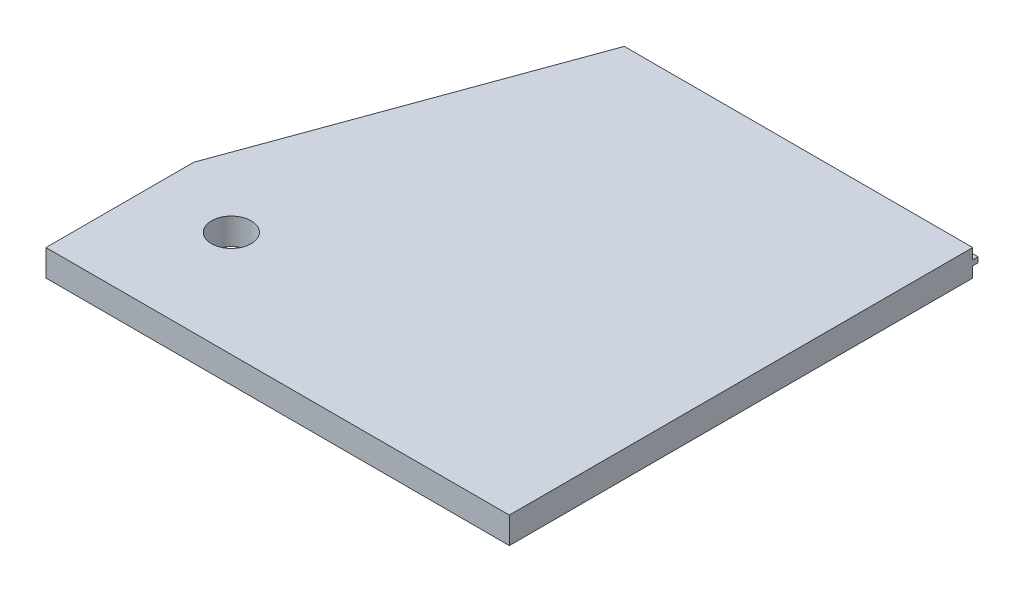
ISO-10303-21;
HEADER;
FILE_DESCRIPTION(('STEP AP214'),'2;1');
FILE_NAME('part.step','',(''),(''),'','','');
FILE_SCHEMA(('AUTOMOTIVE_DESIGN { 1 0 10303 214 1 1 1 1 }'));
ENDSEC;
DATA;
#1=APPLICATION_CONTEXT('core data for automotive mechanical design processes');
#2=APPLICATION_PROTOCOL_DEFINITION('international standard','automotive_design',2000,#1);
#3=PRODUCT_CONTEXT('',#1,'mechanical');
#4=PRODUCT('Part','Part','',(#3));
#5=PRODUCT_RELATED_PRODUCT_CATEGORY('part','',(#4));
#6=PRODUCT_DEFINITION_FORMATION('','',#4);
#7=PRODUCT_DEFINITION_CONTEXT('part definition',#1,'design');
#8=PRODUCT_DEFINITION('design','',#6,#7);
#9=PRODUCT_DEFINITION_SHAPE('','',#8);
#10=(LENGTH_UNIT() NAMED_UNIT(*) SI_UNIT(.MILLI.,.METRE.));
#11=(NAMED_UNIT(*) PLANE_ANGLE_UNIT() SI_UNIT($,.RADIAN.));
#12=(NAMED_UNIT(*) SI_UNIT($,.STERADIAN.) SOLID_ANGLE_UNIT());
#13=UNCERTAINTY_MEASURE_WITH_UNIT(LENGTH_MEASURE(1.E-05),#10,'distance_accuracy_value','');
#14=(GEOMETRIC_REPRESENTATION_CONTEXT(3) GLOBAL_UNCERTAINTY_ASSIGNED_CONTEXT((#13)) GLOBAL_UNIT_ASSIGNED_CONTEXT((#10,
#11,#12)) REPRESENTATION_CONTEXT('',''));
#15=CARTESIAN_POINT('',(0.,0.,0.));
#16=DIRECTION('',(0.,0.,1.));
#17=DIRECTION('',(1.,0.,0.));
#18=AXIS2_PLACEMENT_3D('',#15,#16,#17);
#19=CARTESIAN_POINT('',(43.4099999999999,10.,-175.));
#20=DIRECTION('',(0.,0.,1.));
#21=DIRECTION('',(1.,0.,0.));
#22=AXIS2_PLACEMENT_3D('',#19,#20,#21);
#23=PLANE('',#22);
#24=DIRECTION('',(1.,0.,0.));
#25=VECTOR('',#24,1.);
#26=CARTESIAN_POINT('',(175.,6.,-175.));
#27=LINE('',#26,#25);
#28=CARTESIAN_POINT('',(43.4099999999999,6.,-175.));
#29=VERTEX_POINT('',#28);
#30=CARTESIAN_POINT('',(175.,6.,-175.));
#31=VERTEX_POINT('',#30);
#32=EDGE_CURVE('E128',#29,#31,#27,.T.);
#33=ORIENTED_EDGE('',*,*,#32,.F.);
#34=DIRECTION('',(0.,-1.,0.));
#35=VECTOR('',#34,1.);
#36=CARTESIAN_POINT('',(43.4099999999999,10.,-175.));
#37=LINE('',#36,#35);
#38=CARTESIAN_POINT('',(43.4099999999999,10.,-175.));
#39=VERTEX_POINT('',#38);
#40=EDGE_CURVE('E165',#39,#29,#37,.T.);
#41=ORIENTED_EDGE('',*,*,#40,.F.);
#42=DIRECTION('',(-1.,0.,0.));
#43=VECTOR('',#42,1.);
#44=CARTESIAN_POINT('',(43.4099999999999,10.,-175.));
#45=LINE('',#44,#43);
#46=CARTESIAN_POINT('',(175.,10.,-175.));
#47=VERTEX_POINT('',#46);
#48=EDGE_CURVE('E150',#47,#39,#45,.T.);
#49=ORIENTED_EDGE('',*,*,#48,.F.);
#50=DIRECTION('',(0.,-1.,0.));
#51=VECTOR('',#50,1.);
#52=CARTESIAN_POINT('',(175.,10.,-175.));
#53=LINE('',#52,#51);
#54=EDGE_CURVE('E59',#47,#31,#53,.T.);
#55=ORIENTED_EDGE('',*,*,#54,.T.);
#56=EDGE_LOOP('',(#33,#41,#49,#55));
#57=FACE_BOUND('',#56,.T.);
#58=ADVANCED_FACE('F36',(#57),#23,.F.);
#59=DIRECTION('',(-1.,0.,0.));
#60=VECTOR('',#59,1.);
#61=CARTESIAN_POINT('',(175.,4.,-175.));
#62=LINE('',#61,#60);
#63=CARTESIAN_POINT('',(175.,4.00000000000002,-175.));
#64=VERTEX_POINT('',#63);
#65=CARTESIAN_POINT('',(43.4099999999999,4.00000000000005,-175.));
#66=VERTEX_POINT('',#65);
#67=EDGE_CURVE('E51',#64,#66,#62,.T.);
#68=ORIENTED_EDGE('',*,*,#67,.F.);
#69=CARTESIAN_POINT('',(175.,0.,-175.));
#70=VERTEX_POINT('',#69);
#71=EDGE_CURVE('E132',#64,#70,#53,.T.);
#72=ORIENTED_EDGE('',*,*,#71,.T.);
#73=DIRECTION('',(-1.,0.,0.));
#74=VECTOR('',#73,1.);
#75=CARTESIAN_POINT('',(43.4099999999999,0.,-175.));
#76=LINE('',#75,#74);
#77=CARTESIAN_POINT('',(43.4099999999999,0.,-175.));
#78=VERTEX_POINT('',#77);
#79=EDGE_CURVE('E158',#70,#78,#76,.T.);
#80=ORIENTED_EDGE('',*,*,#79,.T.);
#81=EDGE_CURVE('E164',#66,#78,#37,.T.);
#82=ORIENTED_EDGE('',*,*,#81,.F.);
#83=EDGE_LOOP('',(#68,#72,#80,#82));
#84=FACE_BOUND('',#83,.T.);
#85=ADVANCED_FACE('F178',(#84),#23,.F.);
#86=CARTESIAN_POINT('',(0.,10.,0.));
#87=DIRECTION('',(1.,0.,0.));
#88=DIRECTION('',(0.,0.,-1.));
#89=AXIS2_PLACEMENT_3D('',#86,#87,#88);
#90=PLANE('',#89);
#91=DIRECTION('',(0.,0.,1.));
#92=VECTOR('',#91,1.);
#93=CARTESIAN_POINT('',(0.,0.,0.));
#94=LINE('',#93,#92);
#95=CARTESIAN_POINT('',(0.,0.,-55.76));
#96=VERTEX_POINT('',#95);
#97=CARTESIAN_POINT('',(0.,0.,0.));
#98=VERTEX_POINT('',#97);
#99=EDGE_CURVE('E133',#96,#98,#94,.T.);
#100=ORIENTED_EDGE('',*,*,#99,.T.);
#101=DIRECTION('',(0.,-1.,0.));
#102=VECTOR('',#101,1.);
#103=CARTESIAN_POINT('',(0.,10.,0.));
#104=LINE('',#103,#102);
#105=CARTESIAN_POINT('',(0.,10.,0.));
#106=VERTEX_POINT('',#105);
#107=EDGE_CURVE('E11',#106,#98,#104,.T.);
#108=ORIENTED_EDGE('',*,*,#107,.F.);
#109=DIRECTION('',(0.,0.,1.));
#110=VECTOR('',#109,1.);
#111=CARTESIAN_POINT('',(0.,10.,0.));
#112=LINE('',#111,#110);
#113=CARTESIAN_POINT('',(0.,10.,-55.76));
#114=VERTEX_POINT('',#113);
#115=EDGE_CURVE('E142',#114,#106,#112,.T.);
#116=ORIENTED_EDGE('',*,*,#115,.F.);
#117=DIRECTION('',(0.,-1.,0.));
#118=VECTOR('',#117,1.);
#119=CARTESIAN_POINT('',(0.,10.,-55.76));
#120=LINE('',#119,#118);
#121=EDGE_CURVE('E153',#114,#96,#120,.T.);
#122=ORIENTED_EDGE('',*,*,#121,.T.);
#123=EDGE_LOOP('',(#100,#108,#116,#122));
#124=FACE_BOUND('',#123,.T.);
#125=ADVANCED_FACE('F38',(#124),#90,.F.);
#126=CARTESIAN_POINT('',(0.,10.,0.));
#127=DIRECTION('',(0.,0.,-1.));
#128=DIRECTION('',(-1.,0.,0.));
#129=AXIS2_PLACEMENT_3D('',#126,#127,#128);
#130=PLANE('',#129);
#131=DIRECTION('',(1.,0.,0.));
#132=VECTOR('',#131,1.);
#133=CARTESIAN_POINT('',(0.,0.,0.));
#134=LINE('',#133,#132);
#135=CARTESIAN_POINT('',(175.,0.,0.));
#136=VERTEX_POINT('',#135);
#137=EDGE_CURVE('E136',#98,#136,#134,.T.);
#138=ORIENTED_EDGE('',*,*,#137,.T.);
#139=DIRECTION('',(0.,-1.,0.));
#140=VECTOR('',#139,1.);
#141=CARTESIAN_POINT('',(175.,10.,0.));
#142=LINE('',#141,#140);
#143=CARTESIAN_POINT('',(175.,10.,0.));
#144=VERTEX_POINT('',#143);
#145=EDGE_CURVE('E44',#144,#136,#142,.T.);
#146=ORIENTED_EDGE('',*,*,#145,.F.);
#147=DIRECTION('',(1.,0.,0.));
#148=VECTOR('',#147,1.);
#149=CARTESIAN_POINT('',(0.,10.,0.));
#150=LINE('',#149,#148);
#151=EDGE_CURVE('E145',#106,#144,#150,.T.);
#152=ORIENTED_EDGE('',*,*,#151,.F.);
#153=ORIENTED_EDGE('',*,*,#107,.T.);
#154=EDGE_LOOP('',(#138,#146,#152,#153));
#155=FACE_BOUND('',#154,.T.);
#156=ADVANCED_FACE('F203',(#155),#130,.F.);
#157=CARTESIAN_POINT('',(175.,10.,0.));
#158=DIRECTION('',(-1.,0.,0.));
#159=DIRECTION('',(0.,0.,1.));
#160=AXIS2_PLACEMENT_3D('',#157,#158,#159);
#161=PLANE('',#160);
#162=DIRECTION('',(0.,0.,-1.));
#163=VECTOR('',#162,1.);
#164=CARTESIAN_POINT('',(175.,0.,0.));
#165=LINE('',#164,#163);
#166=EDGE_CURVE('E156',#136,#70,#165,.T.);
#167=ORIENTED_EDGE('',*,*,#166,.T.);
#168=ORIENTED_EDGE('',*,*,#71,.F.);
#169=DIRECTION('',(0.,0.,1.));
#170=VECTOR('',#169,1.);
#171=CARTESIAN_POINT('',(175.,4.,-177.));
#172=LINE('',#171,#170);
#173=CARTESIAN_POINT('',(175.,4.,-177.));
#174=VERTEX_POINT('',#173);
#175=EDGE_CURVE('E113',#174,#64,#172,.T.);
#176=ORIENTED_EDGE('',*,*,#175,.F.);
#177=DIRECTION('',(0.,-1.,0.));
#178=VECTOR('',#177,1.);
#179=CARTESIAN_POINT('',(175.,6.,-177.));
#180=LINE('',#179,#178);
#181=CARTESIAN_POINT('',(175.,6.,-177.));
#182=VERTEX_POINT('',#181);
#183=EDGE_CURVE('E119',#182,#174,#180,.T.);
#184=ORIENTED_EDGE('',*,*,#183,.F.);
#185=DIRECTION('',(0.,0.,1.));
#186=VECTOR('',#185,1.);
#187=CARTESIAN_POINT('',(175.,6.,-177.));
#188=LINE('',#187,#186);
#189=EDGE_CURVE('E189',#182,#31,#188,.T.);
#190=ORIENTED_EDGE('',*,*,#189,.T.);
#191=ORIENTED_EDGE('',*,*,#54,.F.);
#192=DIRECTION('',(0.,0.,-1.));
#193=VECTOR('',#192,1.);
#194=CARTESIAN_POINT('',(175.,10.,0.));
#195=LINE('',#194,#193);
#196=EDGE_CURVE('E148',#144,#47,#195,.T.);
#197=ORIENTED_EDGE('',*,*,#196,.F.);
#198=ORIENTED_EDGE('',*,*,#145,.T.);
#199=EDGE_LOOP('',(#167,#168,#176,#184,#190,#191,#197,#198));
#200=FACE_BOUND('',#199,.T.);
#201=ADVANCED_FACE('F131',(#200),#161,.F.);
#202=CARTESIAN_POINT('',(0.,10.,-55.76));
#203=DIRECTION('',(0.939666811419698,0.,0.342091045653547));
#204=DIRECTION('',(0.342091045653547,0.,-0.939666811419698));
#205=AXIS2_PLACEMENT_3D('',#202,#203,#204);
#206=PLANE('',#205);
#207=DIRECTION('',(-0.342091045653547,0.,0.939666811419698));
#208=VECTOR('',#207,1.);
#209=CARTESIAN_POINT('',(0.,0.,-55.76));
#210=LINE('',#209,#208);
#211=EDGE_CURVE('E146',#78,#96,#210,.T.);
#212=ORIENTED_EDGE('',*,*,#211,.T.);
#213=ORIENTED_EDGE('',*,*,#121,.F.);
#214=DIRECTION('',(-0.342091045653547,0.,0.939666811419698));
#215=VECTOR('',#214,1.);
#216=CARTESIAN_POINT('',(0.,10.,-55.76));
#217=LINE('',#216,#215);
#218=EDGE_CURVE('E152',#39,#114,#217,.T.);
#219=ORIENTED_EDGE('',*,*,#218,.F.);
#220=ORIENTED_EDGE('',*,*,#40,.T.);
#221=DIRECTION('',(0.,1.,0.));
#222=VECTOR('',#221,1.);
#223=CARTESIAN_POINT('',(43.4099999999999,6.,-175.));
#224=LINE('',#223,#222);
#225=EDGE_CURVE('E180',#66,#29,#224,.T.);
#226=ORIENTED_EDGE('',*,*,#225,.F.);
#227=ORIENTED_EDGE('',*,*,#81,.T.);
#228=EDGE_LOOP('',(#212,#213,#219,#220,#226,#227));
#229=FACE_BOUND('',#228,.T.);
#230=ADVANCED_FACE('F205',(#229),#206,.F.);
#231=CARTESIAN_POINT('',(0.,10.,0.));
#232=DIRECTION('',(0.,-1.,0.));
#233=DIRECTION('',(0.,0.,-1.));
#234=AXIS2_PLACEMENT_3D('',#231,#232,#233);
#235=PLANE('',#234);
#236=CARTESIAN_POINT('',(30.,10.,-40.));
#237=DIRECTION('',(0.,1.,0.));
#238=DIRECTION('',(0.,0.,1.));
#239=AXIS2_PLACEMENT_3D('',#236,#237,#238);
#240=CIRCLE('',#239,7.5);
#241=CARTESIAN_POINT('',(30.,10.,-32.5));
#242=VERTEX_POINT('',#241);
#243=EDGE_CURVE('E309',#242,#242,#240,.T.);
#244=ORIENTED_EDGE('',*,*,#243,.F.);
#245=EDGE_LOOP('',(#244));
#246=FACE_BOUND('',#245,.T.);
#247=ORIENTED_EDGE('',*,*,#115,.T.);
#248=ORIENTED_EDGE('',*,*,#151,.T.);
#249=ORIENTED_EDGE('',*,*,#196,.T.);
#250=ORIENTED_EDGE('',*,*,#48,.T.);
#251=ORIENTED_EDGE('',*,*,#218,.T.);
#252=EDGE_LOOP('',(#247,#248,#249,#250,#251));
#253=FACE_BOUND('',#252,.T.);
#254=ADVANCED_FACE('F199',(#246,#253),#235,.F.);
#255=CARTESIAN_POINT('',(0.,0.,0.));
#256=DIRECTION('',(0.,-1.,0.));
#257=DIRECTION('',(0.,0.,-1.));
#258=AXIS2_PLACEMENT_3D('',#255,#256,#257);
#259=PLANE('',#258);
#260=CARTESIAN_POINT('',(30.,0.,-40.));
#261=DIRECTION('',(0.,1.,0.));
#262=DIRECTION('',(0.,0.,1.));
#263=AXIS2_PLACEMENT_3D('',#260,#261,#262);
#264=CIRCLE('',#263,7.5);
#265=CARTESIAN_POINT('',(30.,0.,-32.5));
#266=VERTEX_POINT('',#265);
#267=EDGE_CURVE('E181',#266,#266,#264,.T.);
#268=ORIENTED_EDGE('',*,*,#267,.T.);
#269=EDGE_LOOP('',(#268));
#270=FACE_BOUND('',#269,.T.);
#271=ORIENTED_EDGE('',*,*,#99,.F.);
#272=ORIENTED_EDGE('',*,*,#211,.F.);
#273=ORIENTED_EDGE('',*,*,#79,.F.);
#274=ORIENTED_EDGE('',*,*,#166,.F.);
#275=ORIENTED_EDGE('',*,*,#137,.F.);
#276=EDGE_LOOP('',(#271,#272,#273,#274,#275));
#277=FACE_BOUND('',#276,.T.);
#278=ADVANCED_FACE('F176',(#270,#277),#259,.T.);
#279=CARTESIAN_POINT('',(175.,4.,-177.));
#280=DIRECTION('',(0.,1.,0.));
#281=DIRECTION('',(-1.,0.,0.));
#282=AXIS2_PLACEMENT_3D('',#279,#280,#281);
#283=PLANE('',#282);
#284=ORIENTED_EDGE('',*,*,#67,.T.);
#285=DIRECTION('',(0.,0.,1.));
#286=VECTOR('',#285,1.);
#287=CARTESIAN_POINT('',(43.4099999999999,4.00000000000005,-177.));
#288=LINE('',#287,#286);
#289=CARTESIAN_POINT('',(43.4099999999999,4.00000000000005,-177.));
#290=VERTEX_POINT('',#289);
#291=EDGE_CURVE('E115',#290,#66,#288,.T.);
#292=ORIENTED_EDGE('',*,*,#291,.F.);
#293=DIRECTION('',(-1.,0.,0.));
#294=VECTOR('',#293,1.);
#295=CARTESIAN_POINT('',(175.,4.,-177.));
#296=LINE('',#295,#294);
#297=EDGE_CURVE('E109',#174,#290,#296,.T.);
#298=ORIENTED_EDGE('',*,*,#297,.F.);
#299=ORIENTED_EDGE('',*,*,#175,.T.);
#300=EDGE_LOOP('',(#284,#292,#298,#299));
#301=FACE_BOUND('',#300,.T.);
#302=ADVANCED_FACE('F111',(#301),#283,.F.);
#303=CARTESIAN_POINT('',(43.4099999999999,6.,-177.));
#304=DIRECTION('',(1.,0.,0.));
#305=DIRECTION('',(0.,0.,-1.));
#306=AXIS2_PLACEMENT_3D('',#303,#304,#305);
#307=PLANE('',#306);
#308=ORIENTED_EDGE('',*,*,#225,.T.);
#309=DIRECTION('',(0.,0.,1.));
#310=VECTOR('',#309,1.);
#311=CARTESIAN_POINT('',(43.4099999999999,6.,-177.));
#312=LINE('',#311,#310);
#313=CARTESIAN_POINT('',(43.4099999999999,6.,-177.));
#314=VERTEX_POINT('',#313);
#315=EDGE_CURVE('E138',#314,#29,#312,.T.);
#316=ORIENTED_EDGE('',*,*,#315,.F.);
#317=DIRECTION('',(0.,1.,0.));
#318=VECTOR('',#317,1.);
#319=CARTESIAN_POINT('',(43.4099999999999,6.,-177.));
#320=LINE('',#319,#318);
#321=EDGE_CURVE('E118',#290,#314,#320,.T.);
#322=ORIENTED_EDGE('',*,*,#321,.F.);
#323=ORIENTED_EDGE('',*,*,#291,.T.);
#324=EDGE_LOOP('',(#308,#316,#322,#323));
#325=FACE_BOUND('',#324,.T.);
#326=ADVANCED_FACE('F185',(#325),#307,.F.);
#327=CARTESIAN_POINT('',(175.,6.,-177.));
#328=DIRECTION('',(0.,-1.,0.));
#329=DIRECTION('',(0.,0.,-1.));
#330=AXIS2_PLACEMENT_3D('',#327,#328,#329);
#331=PLANE('',#330);
#332=ORIENTED_EDGE('',*,*,#32,.T.);
#333=ORIENTED_EDGE('',*,*,#189,.F.);
#334=DIRECTION('',(1.,0.,0.));
#335=VECTOR('',#334,1.);
#336=CARTESIAN_POINT('',(175.,6.,-177.));
#337=LINE('',#336,#335);
#338=EDGE_CURVE('E124',#314,#182,#337,.T.);
#339=ORIENTED_EDGE('',*,*,#338,.F.);
#340=ORIENTED_EDGE('',*,*,#315,.T.);
#341=EDGE_LOOP('',(#332,#333,#339,#340));
#342=FACE_BOUND('',#341,.T.);
#343=ADVANCED_FACE('F195',(#342),#331,.F.);
#344=CARTESIAN_POINT('',(0.,0.,-177.));
#345=DIRECTION('',(0.,0.,-1.));
#346=DIRECTION('',(-1.,0.,0.));
#347=AXIS2_PLACEMENT_3D('',#344,#345,#346);
#348=PLANE('',#347);
#349=ORIENTED_EDGE('',*,*,#183,.T.);
#350=ORIENTED_EDGE('',*,*,#297,.T.);
#351=ORIENTED_EDGE('',*,*,#321,.T.);
#352=ORIENTED_EDGE('',*,*,#338,.T.);
#353=EDGE_LOOP('',(#349,#350,#351,#352));
#354=FACE_BOUND('',#353,.T.);
#355=ADVANCED_FACE('F122',(#354),#348,.T.);
#356=CARTESIAN_POINT('',(30.,0.,-40.));
#357=DIRECTION('',(0.,1.,0.));
#358=DIRECTION('',(0.,0.,1.));
#359=AXIS2_PLACEMENT_3D('',#356,#357,#358);
#360=CYLINDRICAL_SURFACE('',#359,7.5);
#361=ORIENTED_EDGE('',*,*,#267,.F.);
#362=EDGE_LOOP('',(#361));
#363=FACE_BOUND('',#362,.T.);
#364=ORIENTED_EDGE('',*,*,#243,.T.);
#365=EDGE_LOOP('',(#364));
#366=FACE_BOUND('',#365,.T.);
#367=ADVANCED_FACE('F280',(#363,#366),#360,.F.);
#368=CLOSED_SHELL('',(#58,#85,#125,#156,#201,#230,#254,#278,#302,#326,#343,#355,#367));
#369=MANIFOLD_SOLID_BREP('B2',#368);
#370=ADVANCED_BREP_SHAPE_REPRESENTATION('',(#18,#369),#14);
#371=SHAPE_DEFINITION_REPRESENTATION(#9,#370);
ENDSEC;
END-ISO-10303-21;
